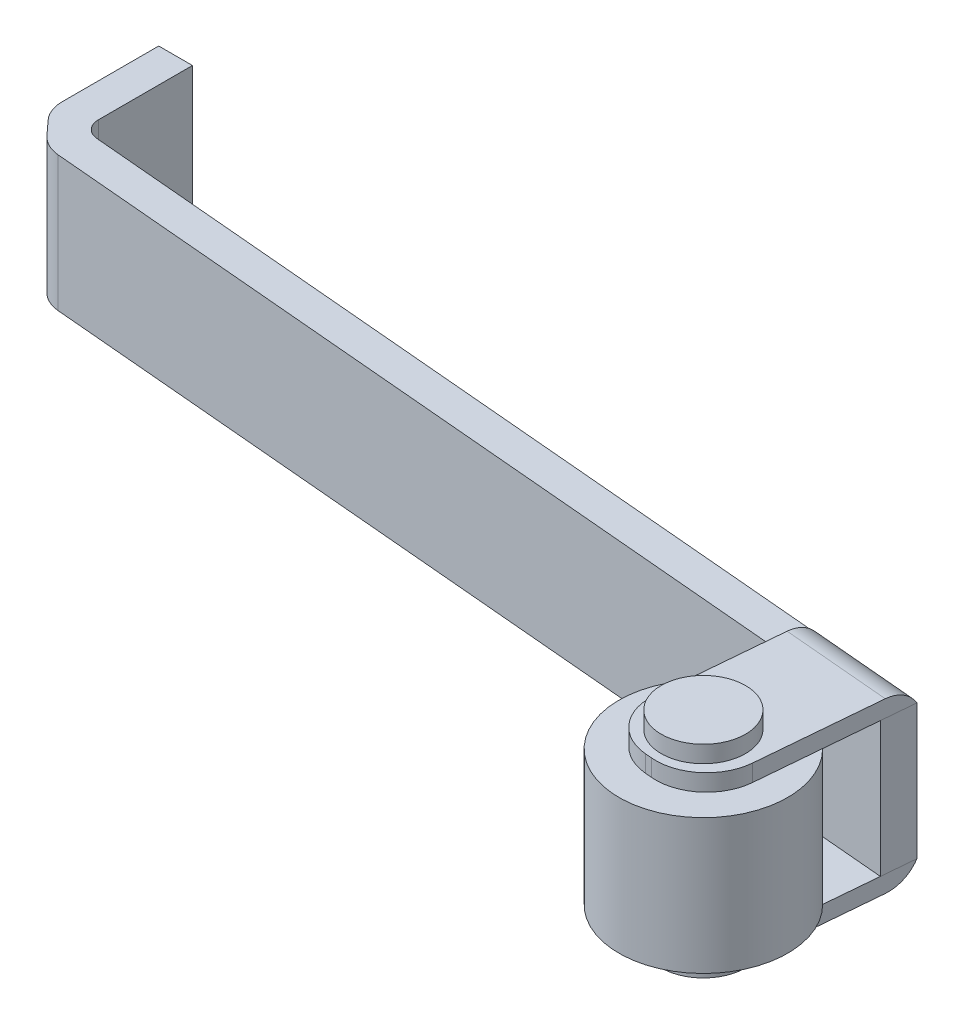
ISO-10303-21;
HEADER;
FILE_DESCRIPTION(('STEP AP214'),'2;1');
FILE_NAME('part.step','',(''),(''),'','','');
FILE_SCHEMA(('AUTOMOTIVE_DESIGN { 1 0 10303 214 1 1 1 1 }'));
ENDSEC;
DATA;
#1=APPLICATION_CONTEXT('core data for automotive mechanical design processes');
#2=APPLICATION_PROTOCOL_DEFINITION('international standard','automotive_design',2000,#1);
#3=PRODUCT_CONTEXT('',#1,'mechanical');
#4=PRODUCT('Part','Part','',(#3));
#5=PRODUCT_RELATED_PRODUCT_CATEGORY('part','',(#4));
#6=PRODUCT_DEFINITION_FORMATION('','',#4);
#7=PRODUCT_DEFINITION_CONTEXT('part definition',#1,'design');
#8=PRODUCT_DEFINITION('design','',#6,#7);
#9=PRODUCT_DEFINITION_SHAPE('','',#8);
#10=(LENGTH_UNIT() NAMED_UNIT(*) SI_UNIT(.MILLI.,.METRE.));
#11=(NAMED_UNIT(*) PLANE_ANGLE_UNIT() SI_UNIT($,.RADIAN.));
#12=(NAMED_UNIT(*) SI_UNIT($,.STERADIAN.) SOLID_ANGLE_UNIT());
#13=UNCERTAINTY_MEASURE_WITH_UNIT(LENGTH_MEASURE(1.E-05),#10,'distance_accuracy_value','');
#14=(GEOMETRIC_REPRESENTATION_CONTEXT(3) GLOBAL_UNCERTAINTY_ASSIGNED_CONTEXT((#13)) GLOBAL_UNIT_ASSIGNED_CONTEXT((#10,
#11,#12)) REPRESENTATION_CONTEXT('',''));
#15=CARTESIAN_POINT('',(0.,0.,0.));
#16=DIRECTION('',(0.,0.,1.));
#17=DIRECTION('',(1.,0.,0.));
#18=AXIS2_PLACEMENT_3D('',#15,#16,#17);
#19=CARTESIAN_POINT('',(28.0961628673172,6.75000000000002,5.6244415046445));
#20=DIRECTION('',(0.,-1.,0.));
#21=DIRECTION('',(0.,0.,-1.));
#22=AXIS2_PLACEMENT_3D('',#19,#20,#21);
#23=PLANE('',#22);
#24=DIRECTION('',(-0.087155742747656,0.,0.996194698091746));
#25=VECTOR('',#24,1.);
#26=CARTESIAN_POINT('',(28.0961628673172,6.75000000000002,5.6244415046445));
#27=LINE('',#26,#25);
#28=CARTESIAN_POINT('',(28.0961628673172,6.75000000000002,5.6244415046445));
#29=VERTEX_POINT('',#28);
#30=CARTESIAN_POINT('',(27.8713827395985,6.75000000000002,8.19369012109135));
#31=VERTEX_POINT('',#30);
#32=EDGE_CURVE('E198',#29,#31,#27,.T.);
#33=ORIENTED_EDGE('',*,*,#32,.T.);
#34=CARTESIAN_POINT('',(26.110050508006,6.75000000000001,9.9678684576611));
#35=DIRECTION('',(0.,1.,0.));
#36=DIRECTION('',(-1.,0.,0.));
#37=AXIS2_PLACEMENT_3D('',#34,#35,#36);
#38=CIRCLE('',#37,2.5);
#39=CARTESIAN_POINT('',(24.6835597057049,6.75000000000002,7.91479174429885));
#40=VERTEX_POINT('',#39);
#41=EDGE_CURVE('E68',#31,#40,#38,.T.);
#42=ORIENTED_EDGE('',*,*,#41,.T.);
#43=DIRECTION('',(-0.087155742747656,0.,0.996194698091746));
#44=VECTOR('',#43,1.);
#45=CARTESIAN_POINT('',(24.9083398334236,6.75000000000002,5.345543127852));
#46=LINE('',#45,#44);
#47=CARTESIAN_POINT('',(24.9083398334236,6.75000000000002,5.345543127852));
#48=VERTEX_POINT('',#47);
#49=EDGE_CURVE('E201',#48,#40,#46,.T.);
#50=ORIENTED_EDGE('',*,*,#49,.F.);
#51=DIRECTION('',(0.996194698091746,0.,0.0871557427476555));
#52=VECTOR('',#51,1.);
#53=CARTESIAN_POINT('',(28.0961628673172,6.75000000000002,5.6244415046445));
#54=LINE('',#53,#52);
#55=EDGE_CURVE('E194',#48,#29,#54,.T.);
#56=ORIENTED_EDGE('',*,*,#55,.T.);
#57=EDGE_LOOP('',(#33,#42,#50,#56));
#58=FACE_BOUND('',#57,.T.);
#59=ADVANCED_FACE('F44',(#58),#23,.T.);
#60=CARTESIAN_POINT('',(28.0961628673172,7.25000000000002,5.6244415046445));
#61=DIRECTION('',(0.,1.,0.));
#62=DIRECTION('',(-1.,0.,0.));
#63=AXIS2_PLACEMENT_3D('',#60,#61,#62);
#64=PLANE('',#63);
#65=DIRECTION('',(-0.996194698091746,0.,-0.0871557427476555));
#66=VECTOR('',#65,1.);
#67=CARTESIAN_POINT('',(27.5732284108313,7.25000000000002,11.601609693195));
#68=LINE('',#67,#66);
#69=CARTESIAN_POINT('',(26.0789363636937,7.25000000000002,11.4708760790735));
#70=VERTEX_POINT('',#69);
#71=CARTESIAN_POINT('',(25.8796974240753,7.25000000000002,11.453444930524));
#72=VERTEX_POINT('',#71);
#73=EDGE_CURVE('E189',#70,#72,#68,.T.);
#74=ORIENTED_EDGE('',*,*,#73,.F.);
#75=CARTESIAN_POINT('',(26.2096699778152,7.25000000000002,9.97658403193587));
#76=DIRECTION('',(0.,1.,0.));
#77=DIRECTION('',(-1.,0.,0.));
#78=AXIS2_PLACEMENT_3D('',#75,#76,#77);
#79=CIRCLE('',#78,1.5);
#80=CARTESIAN_POINT('',(27.7039620249528,7.25000000000002,10.1073176460574));
#81=VERTEX_POINT('',#80);
#82=EDGE_CURVE('E222',#70,#81,#79,.T.);
#83=ORIENTED_EDGE('',*,*,#82,.T.);
#84=DIRECTION('',(-0.087155742747656,0.,0.996194698091746));
#85=VECTOR('',#84,1.);
#86=CARTESIAN_POINT('',(28.0961628673172,7.25000000000002,5.6244415046445));
#87=LINE('',#86,#85);
#88=CARTESIAN_POINT('',(28.020683780012,7.25000000000002,6.48717142030732));
#89=VERTEX_POINT('',#88);
#90=EDGE_CURVE('E197',#89,#81,#87,.T.);
#91=ORIENTED_EDGE('',*,*,#90,.F.);
#92=DIRECTION('',(-0.996194698091746,0.,-0.0871557427476555));
#93=VECTOR('',#92,1.);
#94=CARTESIAN_POINT('',(24.8328607461185,7.25000000000002,6.20827304351482));
#95=LINE('',#94,#93);
#96=CARTESIAN_POINT('',(24.8328607461185,7.25000000000002,6.20827304351482));
#97=VERTEX_POINT('',#96);
#98=EDGE_CURVE('E200',#89,#97,#95,.T.);
#99=ORIENTED_EDGE('',*,*,#98,.T.);
#100=DIRECTION('',(-0.087155742747656,0.,0.996194698091746));
#101=VECTOR('',#100,1.);
#102=CARTESIAN_POINT('',(24.9083398334236,7.25000000000002,5.345543127852));
#103=LINE('',#102,#101);
#104=CARTESIAN_POINT('',(24.5161389910592,7.25000000000002,9.82841926926485));
#105=VERTEX_POINT('',#104);
#106=EDGE_CURVE('E203',#97,#105,#103,.T.);
#107=ORIENTED_EDGE('',*,*,#106,.T.);
#108=CARTESIAN_POINT('',(26.0104310381968,7.25000000000002,9.95915288338634));
#109=DIRECTION('',(0.,1.,0.));
#110=DIRECTION('',(-1.,0.,0.));
#111=AXIS2_PLACEMENT_3D('',#108,#109,#110);
#112=CIRCLE('',#111,1.5);
#113=EDGE_CURVE('E220',#105,#72,#112,.T.);
#114=ORIENTED_EDGE('',*,*,#113,.T.);
#115=EDGE_LOOP('',(#74,#83,#91,#99,#107,#114));
#116=FACE_BOUND('',#115,.T.);
#117=CARTESIAN_POINT('',(26.110050508006,7.25000000000002,9.9678684576611));
#118=DIRECTION('',(0.,1.,0.));
#119=DIRECTION('',(-1.,0.,0.));
#120=AXIS2_PLACEMENT_3D('',#117,#118,#119);
#121=CIRCLE('',#120,1.25);
#122=CARTESIAN_POINT('',(24.860050508006,7.25000000000002,9.9678684576611));
#123=VERTEX_POINT('',#122);
#124=EDGE_CURVE('E188',#123,#123,#121,.F.);
#125=ORIENTED_EDGE('',*,*,#124,.T.);
#126=EDGE_LOOP('',(#125));
#127=FACE_BOUND('',#126,.T.);
#128=ADVANCED_FACE('F233',(#116,#127),#64,.T.);
#129=CARTESIAN_POINT('',(28.0961628673172,6.75000000000002,5.6244415046445));
#130=DIRECTION('',(0.996194698091746,0.,0.087155742747656));
#131=DIRECTION('',(0.087155742747656,0.,-0.996194698091746));
#132=AXIS2_PLACEMENT_3D('',#129,#130,#131);
#133=PLANE('',#132);
#134=ORIENTED_EDGE('',*,*,#90,.T.);
#135=DIRECTION('',(0.,1.,0.));
#136=VECTOR('',#135,1.);
#137=CARTESIAN_POINT('',(27.7039620249528,6.75000000000002,10.1073176460574));
#138=LINE('',#137,#136);
#139=CARTESIAN_POINT('',(27.7039620249528,6.75000000000002,10.1073176460574));
#140=VERTEX_POINT('',#139);
#141=EDGE_CURVE('E224',#81,#140,#138,.F.);
#142=ORIENTED_EDGE('',*,*,#141,.T.);
#143=DIRECTION('',(-0.087155742747656,0.,0.996194698091746));
#144=VECTOR('',#143,1.);
#145=CARTESIAN_POINT('',(28.0961628673172,6.75000000000001,5.6244415046445));
#146=LINE('',#145,#144);
#147=EDGE_CURVE('E61',#31,#140,#146,.T.);
#148=ORIENTED_EDGE('',*,*,#147,.F.);
#149=ORIENTED_EDGE('',*,*,#32,.F.);
#150=CARTESIAN_POINT('',(28.020683780012,6.25000000000001,6.48717142030732));
#151=DIRECTION('',(0.996194698091746,0.,0.087155742747656));
#152=DIRECTION('',(0.087155742747656,0.,-0.996194698091746));
#153=AXIS2_PLACEMENT_3D('',#150,#151,#152);
#154=CIRCLE('',#153,1.);
#155=EDGE_CURVE('E212',#29,#89,#154,.T.);
#156=ORIENTED_EDGE('',*,*,#155,.T.);
#157=EDGE_LOOP('',(#134,#142,#148,#149,#156));
#158=FACE_BOUND('',#157,.T.);
#159=ADVANCED_FACE('F258',(#158),#133,.T.);
#160=CARTESIAN_POINT('',(24.9083398334236,6.75000000000002,5.345543127852));
#161=DIRECTION('',(-0.996194698091746,0.,-0.087155742747656));
#162=DIRECTION('',(-0.087155742747656,0.,0.996194698091746));
#163=AXIS2_PLACEMENT_3D('',#160,#161,#162);
#164=PLANE('',#163);
#165=ORIENTED_EDGE('',*,*,#49,.T.);
#166=DIRECTION('',(0.087155742747656,0.,-0.996194698091746));
#167=VECTOR('',#166,1.);
#168=CARTESIAN_POINT('',(24.9083398334236,6.75000000000001,5.345543127852));
#169=LINE('',#168,#167);
#170=CARTESIAN_POINT('',(24.5161389910592,6.75000000000001,9.82841926926485));
#171=VERTEX_POINT('',#170);
#172=EDGE_CURVE('E286',#171,#40,#169,.T.);
#173=ORIENTED_EDGE('',*,*,#172,.F.);
#174=DIRECTION('',(0.,-1.,0.));
#175=VECTOR('',#174,1.);
#176=CARTESIAN_POINT('',(24.5161389910592,6.75000000000002,9.82841926926485));
#177=LINE('',#176,#175);
#178=EDGE_CURVE('E12',#171,#105,#177,.F.);
#179=ORIENTED_EDGE('',*,*,#178,.T.);
#180=ORIENTED_EDGE('',*,*,#106,.F.);
#181=CARTESIAN_POINT('',(24.8328607461185,6.25000000000001,6.20827304351482));
#182=DIRECTION('',(-0.996194698091746,0.,-0.087155742747656));
#183=DIRECTION('',(-0.087155742747656,0.,0.996194698091746));
#184=AXIS2_PLACEMENT_3D('',#181,#182,#183);
#185=CIRCLE('',#184,1.);
#186=EDGE_CURVE('E210',#97,#48,#185,.T.);
#187=ORIENTED_EDGE('',*,*,#186,.T.);
#188=EDGE_LOOP('',(#165,#173,#179,#180,#187));
#189=FACE_BOUND('',#188,.T.);
#190=ADVANCED_FACE('F264',(#189),#164,.T.);
#191=CARTESIAN_POINT('',(-0.79784954247906,0.,9.11946200027012));
#192=DIRECTION('',(-0.0871557427476555,0.,0.996194698091746));
#193=DIRECTION('',(0.996194698091746,0.,0.0871557427476555));
#194=AXIS2_PLACEMENT_3D('',#191,#192,#193);
#195=PLANE('',#194);
#196=DIRECTION('',(0.996194698091746,0.,0.0871557427476555));
#197=VECTOR('',#196,1.);
#198=CARTESIAN_POINT('',(27.5732284108313,6.75000000000002,11.601609693195));
#199=LINE('',#198,#197);
#200=CARTESIAN_POINT('',(25.8796974240753,6.75000000000002,11.453444930524));
#201=VERTEX_POINT('',#200);
#202=CARTESIAN_POINT('',(26.0789363636937,6.75000000000002,11.4708760790735));
#203=VERTEX_POINT('',#202);
#204=EDGE_CURVE('E192',#201,#203,#199,.T.);
#205=ORIENTED_EDGE('',*,*,#204,.T.);
#206=DIRECTION('',(0.,1.,0.));
#207=VECTOR('',#206,1.);
#208=CARTESIAN_POINT('',(26.0789363636937,0.,11.4708760790735));
#209=LINE('',#208,#207);
#210=EDGE_CURVE('E217',#203,#70,#209,.T.);
#211=ORIENTED_EDGE('',*,*,#210,.T.);
#212=ORIENTED_EDGE('',*,*,#73,.T.);
#213=DIRECTION('',(0.,-1.,0.));
#214=VECTOR('',#213,1.);
#215=CARTESIAN_POINT('',(25.8796974240753,0.,11.453444930524));
#216=LINE('',#215,#214);
#217=EDGE_CURVE('E214',#72,#201,#216,.T.);
#218=ORIENTED_EDGE('',*,*,#217,.T.);
#219=EDGE_LOOP('',(#205,#211,#212,#218));
#220=FACE_BOUND('',#219,.T.);
#221=ADVANCED_FACE('F263',(#220),#195,.T.);
#222=CARTESIAN_POINT('',(-0.350394173298295,6.25000000000001,4.00502372738246));
#223=DIRECTION('',(0.996194698091746,0.,0.0871557427476555));
#224=DIRECTION('',(0.0871557427476555,0.,-0.996194698091746));
#225=AXIS2_PLACEMENT_3D('',#222,#223,#224);
#226=CYLINDRICAL_SURFACE('',#225,1.);
#227=ORIENTED_EDGE('',*,*,#155,.F.);
#228=ORIENTED_EDGE('',*,*,#55,.F.);
#229=ORIENTED_EDGE('',*,*,#186,.F.);
#230=ORIENTED_EDGE('',*,*,#98,.F.);
#231=EDGE_LOOP('',(#227,#228,#229,#230));
#232=FACE_BOUND('',#231,.T.);
#233=ADVANCED_FACE('F270',(#232),#226,.T.);
#234=CARTESIAN_POINT('',(26.2096699778152,0.,9.97658403193587));
#235=DIRECTION('',(0.,1.,0.));
#236=DIRECTION('',(0.,0.,1.));
#237=AXIS2_PLACEMENT_3D('',#234,#235,#236);
#238=CYLINDRICAL_SURFACE('',#237,1.5);
#239=CARTESIAN_POINT('',(26.2096699778152,6.75000000000002,9.97658403193587));
#240=DIRECTION('',(0.,-1.,0.));
#241=DIRECTION('',(0.,0.,-1.));
#242=AXIS2_PLACEMENT_3D('',#239,#240,#241);
#243=CIRCLE('',#242,1.5);
#244=EDGE_CURVE('E53',#140,#203,#243,.T.);
#245=ORIENTED_EDGE('',*,*,#244,.F.);
#246=ORIENTED_EDGE('',*,*,#141,.F.);
#247=ORIENTED_EDGE('',*,*,#82,.F.);
#248=ORIENTED_EDGE('',*,*,#210,.F.);
#249=EDGE_LOOP('',(#245,#246,#247,#248));
#250=FACE_BOUND('',#249,.T.);
#251=ADVANCED_FACE('F249',(#250),#238,.T.);
#252=CARTESIAN_POINT('',(26.0104310381968,0.,9.95915288338634));
#253=DIRECTION('',(0.,-1.,0.));
#254=DIRECTION('',(0.,0.,-1.));
#255=AXIS2_PLACEMENT_3D('',#252,#253,#254);
#256=CYLINDRICAL_SURFACE('',#255,1.5);
#257=ORIENTED_EDGE('',*,*,#113,.F.);
#258=ORIENTED_EDGE('',*,*,#178,.F.);
#259=CARTESIAN_POINT('',(26.0104310381968,6.75000000000002,9.95915288338634));
#260=DIRECTION('',(0.,-1.,0.));
#261=DIRECTION('',(0.,0.,-1.));
#262=AXIS2_PLACEMENT_3D('',#259,#260,#261);
#263=CIRCLE('',#262,1.5);
#264=EDGE_CURVE('E226',#201,#171,#263,.T.);
#265=ORIENTED_EDGE('',*,*,#264,.F.);
#266=ORIENTED_EDGE('',*,*,#217,.F.);
#267=EDGE_LOOP('',(#257,#258,#265,#266));
#268=FACE_BOUND('',#267,.T.);
#269=ADVANCED_FACE('F46',(#268),#256,.T.);
#270=CARTESIAN_POINT('',(0.,7.75000000000001,0.));
#271=DIRECTION('',(0.,-1.,0.));
#272=DIRECTION('',(1.,0.,0.));
#273=AXIS2_PLACEMENT_3D('',#270,#271,#272);
#274=PLANE('',#273);
#275=CARTESIAN_POINT('',(26.110050508006,7.75000000000001,9.9678684576611));
#276=DIRECTION('',(0.,-1.,0.));
#277=DIRECTION('',(1.,0.,0.));
#278=AXIS2_PLACEMENT_3D('',#275,#276,#277);
#279=CIRCLE('',#278,1.25);
#280=CARTESIAN_POINT('',(27.360050508006,7.75000000000001,9.9678684576611));
#281=VERTEX_POINT('',#280);
#282=EDGE_CURVE('E182',#281,#281,#279,.T.);
#283=ORIENTED_EDGE('',*,*,#282,.F.);
#284=EDGE_LOOP('',(#283));
#285=FACE_BOUND('',#284,.T.);
#286=ADVANCED_FACE('F239',(#285),#274,.F.);
#287=CARTESIAN_POINT('',(26.110050508006,1.75000000000001,9.9678684576611));
#288=DIRECTION('',(0.,1.,0.));
#289=DIRECTION('',(-1.,0.,0.));
#290=AXIS2_PLACEMENT_3D('',#287,#288,#289);
#291=CYLINDRICAL_SURFACE('',#290,1.25);
#292=ORIENTED_EDGE('',*,*,#124,.F.);
#293=EDGE_LOOP('',(#292));
#294=FACE_BOUND('',#293,.T.);
#295=ORIENTED_EDGE('',*,*,#282,.T.);
#296=EDGE_LOOP('',(#295));
#297=FACE_BOUND('',#296,.T.);
#298=ADVANCED_FACE('F235',(#294,#297),#291,.T.);
#299=CARTESIAN_POINT('',(26.110050508006,6.75000000000001,9.9678684576611));
#300=DIRECTION('',(0.,1.,0.));
#301=DIRECTION('',(-1.,0.,0.));
#302=AXIS2_PLACEMENT_3D('',#299,#300,#301);
#303=PLANE('',#302);
#304=EDGE_CURVE('E285',#40,#31,#38,.T.);
#305=ORIENTED_EDGE('',*,*,#304,.T.);
#306=ORIENTED_EDGE('',*,*,#147,.T.);
#307=ORIENTED_EDGE('',*,*,#244,.T.);
#308=ORIENTED_EDGE('',*,*,#204,.F.);
#309=ORIENTED_EDGE('',*,*,#264,.T.);
#310=ORIENTED_EDGE('',*,*,#172,.T.);
#311=EDGE_LOOP('',(#305,#306,#307,#308,#309,#310));
#312=FACE_BOUND('',#311,.T.);
#313=ADVANCED_FACE('F238',(#312),#303,.T.);
#314=CARTESIAN_POINT('',(26.110050508006,6.75000000000001,9.9678684576611));
#315=DIRECTION('',(0.,-1.,0.));
#316=DIRECTION('',(1.,0.,0.));
#317=AXIS2_PLACEMENT_3D('',#314,#315,#316);
#318=CYLINDRICAL_SURFACE('',#317,2.5);
#319=ORIENTED_EDGE('',*,*,#41,.F.);
#320=ORIENTED_EDGE('',*,*,#304,.F.);
#321=EDGE_LOOP('',(#319,#320));
#322=FACE_BOUND('',#321,.T.);
#323=CARTESIAN_POINT('',(26.110050508006,2.75000000000001,9.9678684576611));
#324=DIRECTION('',(0.,1.,0.));
#325=DIRECTION('',(-1.,0.,0.));
#326=AXIS2_PLACEMENT_3D('',#323,#324,#325);
#327=CIRCLE('',#326,2.5);
#328=CARTESIAN_POINT('',(27.8713827395985,2.75000000000001,8.19369012109135));
#329=VERTEX_POINT('',#328);
#330=CARTESIAN_POINT('',(24.6835597057049,2.75000000000001,7.91479174429885));
#331=VERTEX_POINT('',#330);
#332=EDGE_CURVE('E336',#329,#331,#327,.T.);
#333=ORIENTED_EDGE('',*,*,#332,.T.);
#334=EDGE_CURVE('E333',#331,#329,#327,.T.);
#335=ORIENTED_EDGE('',*,*,#334,.T.);
#336=EDGE_LOOP('',(#333,#335));
#337=FACE_BOUND('',#336,.T.);
#338=ADVANCED_FACE('F339',(#322,#337),#318,.T.);
#339=CARTESIAN_POINT('',(26.110050508006,2.75000000000001,9.9678684576611));
#340=DIRECTION('',(0.,1.,0.));
#341=DIRECTION('',(-1.,0.,0.));
#342=AXIS2_PLACEMENT_3D('',#339,#340,#341);
#343=PLANE('',#342);
#344=DIRECTION('',(0.087155742747656,0.,-0.996194698091746));
#345=VECTOR('',#344,1.);
#346=CARTESIAN_POINT('',(24.9083398334236,2.75000000000001,5.345543127852));
#347=LINE('',#346,#345);
#348=CARTESIAN_POINT('',(24.5161389910592,2.75000000000001,9.82841926926485));
#349=VERTEX_POINT('',#348);
#350=EDGE_CURVE('E168',#349,#331,#347,.T.);
#351=ORIENTED_EDGE('',*,*,#350,.F.);
#352=CARTESIAN_POINT('',(26.0104310381968,2.75000000000001,9.95915288338634));
#353=DIRECTION('',(0.,1.,0.));
#354=DIRECTION('',(-1.,0.,0.));
#355=AXIS2_PLACEMENT_3D('',#352,#353,#354);
#356=CIRCLE('',#355,1.5);
#357=CARTESIAN_POINT('',(25.8796974240753,2.75000000000001,11.453444930524));
#358=VERTEX_POINT('',#357);
#359=EDGE_CURVE('E157',#349,#358,#356,.T.);
#360=ORIENTED_EDGE('',*,*,#359,.T.);
#361=DIRECTION('',(-0.996194698091746,0.,-0.0871557427476555));
#362=VECTOR('',#361,1.);
#363=CARTESIAN_POINT('',(27.5732284108313,2.75000000000001,11.601609693195));
#364=LINE('',#363,#362);
#365=CARTESIAN_POINT('',(26.0789363636937,2.75000000000001,11.4708760790735));
#366=VERTEX_POINT('',#365);
#367=EDGE_CURVE('E174',#366,#358,#364,.T.);
#368=ORIENTED_EDGE('',*,*,#367,.F.);
#369=CARTESIAN_POINT('',(26.2096699778152,2.75000000000001,9.97658403193587));
#370=DIRECTION('',(0.,1.,0.));
#371=DIRECTION('',(-1.,0.,0.));
#372=AXIS2_PLACEMENT_3D('',#369,#370,#371);
#373=CIRCLE('',#372,1.5);
#374=CARTESIAN_POINT('',(27.7039620249528,2.75000000000001,10.1073176460574));
#375=VERTEX_POINT('',#374);
#376=EDGE_CURVE('E151',#366,#375,#373,.T.);
#377=ORIENTED_EDGE('',*,*,#376,.T.);
#378=DIRECTION('',(-0.087155742747656,0.,0.996194698091746));
#379=VECTOR('',#378,1.);
#380=CARTESIAN_POINT('',(28.0961628673172,2.75000000000001,5.6244415046445));
#381=LINE('',#380,#379);
#382=EDGE_CURVE('E161',#329,#375,#381,.T.);
#383=ORIENTED_EDGE('',*,*,#382,.F.);
#384=ORIENTED_EDGE('',*,*,#334,.F.);
#385=EDGE_LOOP('',(#351,#360,#368,#377,#383,#384));
#386=FACE_BOUND('',#385,.T.);
#387=ADVANCED_FACE('F172',(#386),#343,.F.);
#388=CARTESIAN_POINT('',(0.,1.75000000000001,0.));
#389=DIRECTION('',(0.,-1.,0.));
#390=DIRECTION('',(1.,0.,0.));
#391=AXIS2_PLACEMENT_3D('',#388,#389,#390);
#392=PLANE('',#391);
#393=CARTESIAN_POINT('',(26.110050508006,1.75000000000001,9.9678684576611));
#394=DIRECTION('',(0.,-1.,0.));
#395=DIRECTION('',(1.,0.,0.));
#396=AXIS2_PLACEMENT_3D('',#393,#394,#395);
#397=CIRCLE('',#396,1.25);
#398=CARTESIAN_POINT('',(27.360050508006,1.75000000000001,9.9678684576611));
#399=VERTEX_POINT('',#398);
#400=EDGE_CURVE('E185',#399,#399,#397,.T.);
#401=ORIENTED_EDGE('',*,*,#400,.T.);
#402=EDGE_LOOP('',(#401));
#403=FACE_BOUND('',#402,.T.);
#404=ADVANCED_FACE('F347',(#403),#392,.T.);
#405=CARTESIAN_POINT('',(26.110050508006,2.25000000000001,9.9678684576611));
#406=DIRECTION('',(0.,-1.,0.));
#407=DIRECTION('',(1.,0.,0.));
#408=AXIS2_PLACEMENT_3D('',#405,#406,#407);
#409=CIRCLE('',#408,1.25);
#410=CARTESIAN_POINT('',(27.360050508006,2.25000000000001,9.9678684576611));
#411=VERTEX_POINT('',#410);
#412=EDGE_CURVE('E48',#411,#411,#409,.T.);
#413=ORIENTED_EDGE('',*,*,#412,.T.);
#414=EDGE_LOOP('',(#413));
#415=FACE_BOUND('',#414,.T.);
#416=ORIENTED_EDGE('',*,*,#400,.F.);
#417=EDGE_LOOP('',(#416));
#418=FACE_BOUND('',#417,.T.);
#419=ADVANCED_FACE('F241',(#415,#418),#291,.T.);
#420=CARTESIAN_POINT('',(-0.350394173298296,3.25000000000001,4.00502372738247));
#421=DIRECTION('',(0.996194698091746,0.,0.0871557427476555));
#422=DIRECTION('',(0.0871557427476555,0.,-0.996194698091746));
#423=AXIS2_PLACEMENT_3D('',#420,#421,#422);
#424=CYLINDRICAL_SURFACE('',#423,1.);
#425=CARTESIAN_POINT('',(24.8328607461185,3.25000000000001,6.20827304351482));
#426=DIRECTION('',(-0.996194698091746,0.,-0.087155742747656));
#427=DIRECTION('',(-0.087155742747656,0.,0.996194698091746));
#428=AXIS2_PLACEMENT_3D('',#425,#426,#427);
#429=CIRCLE('',#428,1.);
#430=CARTESIAN_POINT('',(24.9083398334236,2.75000000000001,5.345543127852));
#431=VERTEX_POINT('',#430);
#432=CARTESIAN_POINT('',(24.8328607461185,2.25000000000001,6.20827304351482));
#433=VERTEX_POINT('',#432);
#434=EDGE_CURVE('E312',#431,#433,#429,.T.);
#435=ORIENTED_EDGE('',*,*,#434,.F.);
#436=DIRECTION('',(-0.996194698091746,0.,-0.0871557427476555));
#437=VECTOR('',#436,1.);
#438=CARTESIAN_POINT('',(28.0961628673172,2.75000000000001,5.6244415046445));
#439=LINE('',#438,#437);
#440=CARTESIAN_POINT('',(28.0961628673172,2.75000000000001,5.6244415046445));
#441=VERTEX_POINT('',#440);
#442=EDGE_CURVE('E295',#441,#431,#439,.T.);
#443=ORIENTED_EDGE('',*,*,#442,.F.);
#444=CARTESIAN_POINT('',(28.020683780012,3.25000000000001,6.48717142030732));
#445=DIRECTION('',(0.996194698091746,0.,0.087155742747656));
#446=DIRECTION('',(0.087155742747656,0.,-0.996194698091746));
#447=AXIS2_PLACEMENT_3D('',#444,#445,#446);
#448=CIRCLE('',#447,1.);
#449=CARTESIAN_POINT('',(28.020683780012,2.25000000000001,6.48717142030732));
#450=VERTEX_POINT('',#449);
#451=EDGE_CURVE('E310',#450,#441,#448,.T.);
#452=ORIENTED_EDGE('',*,*,#451,.F.);
#453=DIRECTION('',(-0.996194698091746,0.,-0.0871557427476555));
#454=VECTOR('',#453,1.);
#455=CARTESIAN_POINT('',(28.020683780012,2.25000000000001,6.48717142030732));
#456=LINE('',#455,#454);
#457=EDGE_CURVE('E300',#433,#450,#456,.F.);
#458=ORIENTED_EDGE('',*,*,#457,.F.);
#459=EDGE_LOOP('',(#435,#443,#452,#458));
#460=FACE_BOUND('',#459,.T.);
#461=ADVANCED_FACE('F357',(#460),#424,.T.);
#462=CARTESIAN_POINT('',(28.0961628673172,2.25000000000001,5.6244415046445));
#463=DIRECTION('',(0.,-1.,0.));
#464=DIRECTION('',(1.,0.,0.));
#465=AXIS2_PLACEMENT_3D('',#462,#463,#464);
#466=PLANE('',#465);
#467=DIRECTION('',(0.996194698091746,0.,0.0871557427476555));
#468=VECTOR('',#467,1.);
#469=CARTESIAN_POINT('',(27.5732284108313,2.25000000000001,11.601609693195));
#470=LINE('',#469,#468);
#471=CARTESIAN_POINT('',(25.8796974240753,2.25000000000001,11.453444930524));
#472=VERTEX_POINT('',#471);
#473=CARTESIAN_POINT('',(26.0789363636937,2.25000000000001,11.4708760790735));
#474=VERTEX_POINT('',#473);
#475=EDGE_CURVE('E288',#472,#474,#470,.T.);
#476=ORIENTED_EDGE('',*,*,#475,.F.);
#477=CARTESIAN_POINT('',(26.0104310381968,2.25000000000001,9.95915288338634));
#478=DIRECTION('',(0.,-1.,0.));
#479=DIRECTION('',(1.,0.,0.));
#480=AXIS2_PLACEMENT_3D('',#477,#478,#479);
#481=CIRCLE('',#480,1.5);
#482=CARTESIAN_POINT('',(24.5161389910592,2.25000000000001,9.82841926926485));
#483=VERTEX_POINT('',#482);
#484=EDGE_CURVE('E178',#472,#483,#481,.T.);
#485=ORIENTED_EDGE('',*,*,#484,.T.);
#486=DIRECTION('',(-0.087155742747656,0.,0.996194698091746));
#487=VECTOR('',#486,1.);
#488=CARTESIAN_POINT('',(24.9083398334236,2.25000000000001,5.345543127852));
#489=LINE('',#488,#487);
#490=EDGE_CURVE('E301',#433,#483,#489,.T.);
#491=ORIENTED_EDGE('',*,*,#490,.F.);
#492=ORIENTED_EDGE('',*,*,#457,.T.);
#493=DIRECTION('',(-0.087155742747656,0.,0.996194698091746));
#494=VECTOR('',#493,1.);
#495=CARTESIAN_POINT('',(28.0961628673172,2.25000000000001,5.6244415046445));
#496=LINE('',#495,#494);
#497=CARTESIAN_POINT('',(27.7039620249528,2.25000000000001,10.1073176460574));
#498=VERTEX_POINT('',#497);
#499=EDGE_CURVE('E298',#450,#498,#496,.T.);
#500=ORIENTED_EDGE('',*,*,#499,.T.);
#501=CARTESIAN_POINT('',(26.2096699778152,2.25000000000001,9.97658403193587));
#502=DIRECTION('',(0.,-1.,0.));
#503=DIRECTION('',(1.,0.,0.));
#504=AXIS2_PLACEMENT_3D('',#501,#502,#503);
#505=CIRCLE('',#504,1.5);
#506=EDGE_CURVE('E153',#498,#474,#505,.T.);
#507=ORIENTED_EDGE('',*,*,#506,.T.);
#508=EDGE_LOOP('',(#476,#485,#491,#492,#500,#507));
#509=FACE_BOUND('',#508,.T.);
#510=ORIENTED_EDGE('',*,*,#412,.F.);
#511=EDGE_LOOP('',(#510));
#512=FACE_BOUND('',#511,.T.);
#513=ADVANCED_FACE('F322',(#509,#512),#466,.T.);
#514=CARTESIAN_POINT('',(26.2096699778152,0.,9.97658403193587));
#515=DIRECTION('',(0.,-1.,0.));
#516=DIRECTION('',(0.,0.,-1.));
#517=AXIS2_PLACEMENT_3D('',#514,#515,#516);
#518=CYLINDRICAL_SURFACE('',#517,1.5);
#519=ORIENTED_EDGE('',*,*,#506,.F.);
#520=DIRECTION('',(0.,1.,0.));
#521=VECTOR('',#520,1.);
#522=CARTESIAN_POINT('',(27.7039620249528,2.25000000000001,10.1073176460574));
#523=LINE('',#522,#521);
#524=EDGE_CURVE('E146',#375,#498,#523,.F.);
#525=ORIENTED_EDGE('',*,*,#524,.F.);
#526=ORIENTED_EDGE('',*,*,#376,.F.);
#527=DIRECTION('',(0.,1.,0.));
#528=VECTOR('',#527,1.);
#529=CARTESIAN_POINT('',(26.0789363636937,2.75000000000001,11.4708760790735));
#530=LINE('',#529,#528);
#531=EDGE_CURVE('E314',#474,#366,#530,.T.);
#532=ORIENTED_EDGE('',*,*,#531,.F.);
#533=EDGE_LOOP('',(#519,#525,#526,#532));
#534=FACE_BOUND('',#533,.T.);
#535=ADVANCED_FACE('F148',(#534),#518,.T.);
#536=CARTESIAN_POINT('',(26.0104310381968,0.,9.95915288338634));
#537=DIRECTION('',(0.,1.,0.));
#538=DIRECTION('',(0.,0.,1.));
#539=AXIS2_PLACEMENT_3D('',#536,#537,#538);
#540=CYLINDRICAL_SURFACE('',#539,1.5);
#541=ORIENTED_EDGE('',*,*,#359,.F.);
#542=DIRECTION('',(0.,-1.,0.));
#543=VECTOR('',#542,1.);
#544=CARTESIAN_POINT('',(24.5161389910592,2.75000000000001,9.82841926926485));
#545=LINE('',#544,#543);
#546=EDGE_CURVE('E175',#483,#349,#545,.F.);
#547=ORIENTED_EDGE('',*,*,#546,.F.);
#548=ORIENTED_EDGE('',*,*,#484,.F.);
#549=DIRECTION('',(0.,-1.,0.));
#550=VECTOR('',#549,1.);
#551=CARTESIAN_POINT('',(25.8796974240753,2.25000000000001,11.453444930524));
#552=LINE('',#551,#550);
#553=EDGE_CURVE('E316',#358,#472,#552,.T.);
#554=ORIENTED_EDGE('',*,*,#553,.F.);
#555=EDGE_LOOP('',(#541,#547,#548,#554));
#556=FACE_BOUND('',#555,.T.);
#557=ADVANCED_FACE('F332',(#556),#540,.T.);
#558=CARTESIAN_POINT('',(-0.79784954247906,0.,9.11946200027012));
#559=DIRECTION('',(0.0871557427476555,0.,-0.996194698091746));
#560=DIRECTION('',(-0.996194698091746,0.,-0.0871557427476555));
#561=AXIS2_PLACEMENT_3D('',#558,#559,#560);
#562=PLANE('',#561);
#563=ORIENTED_EDGE('',*,*,#367,.T.);
#564=ORIENTED_EDGE('',*,*,#553,.T.);
#565=ORIENTED_EDGE('',*,*,#475,.T.);
#566=ORIENTED_EDGE('',*,*,#531,.T.);
#567=EDGE_LOOP('',(#563,#564,#565,#566));
#568=FACE_BOUND('',#567,.T.);
#569=ADVANCED_FACE('F351',(#568),#562,.F.);
#570=CARTESIAN_POINT('',(24.9083398334236,2.75000000000001,5.345543127852));
#571=DIRECTION('',(-0.996194698091746,0.,-0.087155742747656));
#572=DIRECTION('',(-0.087155742747656,0.,0.996194698091746));
#573=AXIS2_PLACEMENT_3D('',#570,#571,#572);
#574=PLANE('',#573);
#575=ORIENTED_EDGE('',*,*,#490,.T.);
#576=ORIENTED_EDGE('',*,*,#546,.T.);
#577=ORIENTED_EDGE('',*,*,#350,.T.);
#578=DIRECTION('',(-0.087155742747656,0.,0.996194698091746));
#579=VECTOR('',#578,1.);
#580=CARTESIAN_POINT('',(24.9083398334236,2.75000000000001,5.345543127852));
#581=LINE('',#580,#579);
#582=EDGE_CURVE('E304',#431,#331,#581,.T.);
#583=ORIENTED_EDGE('',*,*,#582,.F.);
#584=ORIENTED_EDGE('',*,*,#434,.T.);
#585=EDGE_LOOP('',(#575,#576,#577,#583,#584));
#586=FACE_BOUND('',#585,.T.);
#587=ADVANCED_FACE('F329',(#586),#574,.T.);
#588=CARTESIAN_POINT('',(28.0961628673172,2.75000000000001,5.6244415046445));
#589=DIRECTION('',(0.996194698091746,0.,0.087155742747656));
#590=DIRECTION('',(0.087155742747656,0.,-0.996194698091746));
#591=AXIS2_PLACEMENT_3D('',#588,#589,#590);
#592=PLANE('',#591);
#593=DIRECTION('',(-0.087155742747656,0.,0.996194698091746));
#594=VECTOR('',#593,1.);
#595=CARTESIAN_POINT('',(28.0961628673172,2.75000000000001,5.6244415046445));
#596=LINE('',#595,#594);
#597=EDGE_CURVE('E164',#441,#329,#596,.T.);
#598=ORIENTED_EDGE('',*,*,#597,.T.);
#599=ORIENTED_EDGE('',*,*,#382,.T.);
#600=ORIENTED_EDGE('',*,*,#524,.T.);
#601=ORIENTED_EDGE('',*,*,#499,.F.);
#602=ORIENTED_EDGE('',*,*,#451,.T.);
#603=EDGE_LOOP('',(#598,#599,#600,#601,#602));
#604=FACE_BOUND('',#603,.T.);
#605=ADVANCED_FACE('F162',(#604),#592,.T.);
#606=CARTESIAN_POINT('',(28.0961628673172,2.75000000000001,5.6244415046445));
#607=DIRECTION('',(0.,1.,0.));
#608=DIRECTION('',(-1.,0.,0.));
#609=AXIS2_PLACEMENT_3D('',#606,#607,#608);
#610=PLANE('',#609);
#611=ORIENTED_EDGE('',*,*,#582,.T.);
#612=ORIENTED_EDGE('',*,*,#332,.F.);
#613=ORIENTED_EDGE('',*,*,#597,.F.);
#614=ORIENTED_EDGE('',*,*,#442,.T.);
#615=EDGE_LOOP('',(#611,#612,#613,#614));
#616=FACE_BOUND('',#615,.T.);
#617=ADVANCED_FACE('F360',(#616),#610,.T.);
#618=CLOSED_SHELL('',(#59,#128,#159,#190,#221,#233,#251,#269,#286,#298,#313,#338,#387,#404,#419,
#461,#513,#535,#557,#569,#587,#605,#617));
#619=MANIFOLD_SOLID_BREP('B2',#618);
#620=CARTESIAN_POINT('',(1.,0.,4.25));
#621=DIRECTION('',(-1.,0.,0.));
#622=DIRECTION('',(0.,-1.,0.));
#623=AXIS2_PLACEMENT_3D('',#620,#621,#622);
#624=PLANE('',#623);
#625=DIRECTION('',(0.,0.,-1.));
#626=VECTOR('',#625,1.);
#627=CARTESIAN_POINT('',(1.,6.75000000000002,4.25));
#628=LINE('',#627,#626);
#629=CARTESIAN_POINT('',(1.,6.75000000000002,2.79183441299125));
#630=VERTEX_POINT('',#629);
#631=CARTESIAN_POINT('',(1.,6.75000000000002,0.));
#632=VERTEX_POINT('',#631);
#633=EDGE_CURVE('E649',#630,#632,#628,.T.);
#634=ORIENTED_EDGE('',*,*,#633,.F.);
#635=DIRECTION('',(0.,-1.,0.));
#636=VECTOR('',#635,1.);
#637=CARTESIAN_POINT('',(1.,2.75000000000001,2.79183441299125));
#638=LINE('',#637,#636);
#639=CARTESIAN_POINT('',(1.,2.75000000000001,2.79183441299125));
#640=VERTEX_POINT('',#639);
#641=EDGE_CURVE('E656',#630,#640,#638,.T.);
#642=ORIENTED_EDGE('',*,*,#641,.T.);
#643=DIRECTION('',(0.,0.,-1.));
#644=VECTOR('',#643,1.);
#645=CARTESIAN_POINT('',(1.,2.75000000000001,4.25));
#646=LINE('',#645,#644);
#647=CARTESIAN_POINT('',(1.,2.75000000000001,0.));
#648=VERTEX_POINT('',#647);
#649=EDGE_CURVE('E643',#640,#648,#646,.T.);
#650=ORIENTED_EDGE('',*,*,#649,.T.);
#651=DIRECTION('',(0.,1.,0.));
#652=VECTOR('',#651,1.);
#653=CARTESIAN_POINT('',(1.,0.,0.));
#654=LINE('',#653,#652);
#655=EDGE_CURVE('E626',#648,#632,#654,.T.);
#656=ORIENTED_EDGE('',*,*,#655,.T.);
#657=EDGE_LOOP('',(#634,#642,#650,#656));
#658=FACE_BOUND('',#657,.T.);
#659=ADVANCED_FACE('F523',(#658),#624,.F.);
#660=CARTESIAN_POINT('',(0.,6.75000000000001,4.25));
#661=DIRECTION('',(0.,-1.,0.));
#662=DIRECTION('',(1.,0.,0.));
#663=AXIS2_PLACEMENT_3D('',#660,#661,#662);
#664=PLANE('',#663);
#665=DIRECTION('',(0.675590207615657,0.,0.737277336810127));
#666=VECTOR('',#665,1.);
#667=CARTESIAN_POINT('',(0.,6.75000000000001,3.25383442870219));
#668=LINE('',#667,#666);
#669=CARTESIAN_POINT('',(0.262722663189873,6.75000000000001,3.54054590446486));
#670=VERTEX_POINT('',#669);
#671=CARTESIAN_POINT('',(0.650121594062475,6.75000000000001,3.96331765103128));
#672=VERTEX_POINT('',#671);
#673=EDGE_CURVE('E651',#670,#672,#668,.T.);
#674=ORIENTED_EDGE('',*,*,#673,.T.);
#675=CARTESIAN_POINT('',(1.3873989308726,6.75000000000002,3.28772744341562));
#676=DIRECTION('',(0.,-1.,0.));
#677=DIRECTION('',(1.,0.,0.));
#678=AXIS2_PLACEMENT_3D('',#675,#676,#677);
#679=CIRCLE('',#678,1.);
#680=CARTESIAN_POINT('',(1.30024318812494,6.75000000000001,4.28392214150736));
#681=VERTEX_POINT('',#680);
#682=EDGE_CURVE('E531',#672,#681,#679,.F.);
#683=ORIENTED_EDGE('',*,*,#682,.T.);
#684=DIRECTION('',(-0.996194698091746,0.,-0.0871557427476559));
#685=VECTOR('',#684,1.);
#686=CARTESIAN_POINT('',(28.0090071245696,6.75000000000002,6.62063620273624));
#687=LINE('',#686,#685);
#688=CARTESIAN_POINT('',(28.0090071245696,6.75000000000002,6.62063620273624));
#689=VERTEX_POINT('',#688);
#690=EDGE_CURVE('E609',#689,#681,#687,.T.);
#691=ORIENTED_EDGE('',*,*,#690,.F.);
#692=DIRECTION('',(-0.087155742747656,0.,0.996194698091746));
#693=VECTOR('',#692,1.);
#694=CARTESIAN_POINT('',(28.0964957880955,6.75000000000002,5.6206362027362));
#695=LINE('',#694,#693);
#696=CARTESIAN_POINT('',(28.0964957880955,6.75000000000002,5.6206362027362));
#697=VERTEX_POINT('',#696);
#698=EDGE_CURVE('E602',#697,#689,#695,.T.);
#699=ORIENTED_EDGE('',*,*,#698,.F.);
#700=DIRECTION('',(-0.996194698091746,0.,-0.0871557427476559));
#701=VECTOR('',#700,1.);
#702=CARTESIAN_POINT('',(28.0964957880955,6.75000000000002,5.6206362027362));
#703=LINE('',#702,#701);
#704=CARTESIAN_POINT('',(1.45642212862616,6.75000000000002,3.28993176203712));
#705=VERTEX_POINT('',#704);
#706=EDGE_CURVE('E606',#697,#705,#703,.T.);
#707=ORIENTED_EDGE('',*,*,#706,.T.);
#708=CARTESIAN_POINT('',(1.5,6.75000000000001,2.79183441299125));
#709=DIRECTION('',(0.,-1.,0.));
#710=DIRECTION('',(1.,0.,0.));
#711=AXIS2_PLACEMENT_3D('',#708,#709,#710);
#712=CIRCLE('',#711,0.5);
#713=EDGE_CURVE('E662',#705,#630,#712,.T.);
#714=ORIENTED_EDGE('',*,*,#713,.T.);
#715=ORIENTED_EDGE('',*,*,#633,.T.);
#716=DIRECTION('',(-1.,0.,0.));
#717=VECTOR('',#716,1.);
#718=CARTESIAN_POINT('',(0.,6.75000000000001,0.));
#719=LINE('',#718,#717);
#720=CARTESIAN_POINT('',(0.,6.75000000000002,0.));
#721=VERTEX_POINT('',#720);
#722=EDGE_CURVE('E629',#632,#721,#719,.T.);
#723=ORIENTED_EDGE('',*,*,#722,.T.);
#724=DIRECTION('',(0.,0.,-1.));
#725=VECTOR('',#724,1.);
#726=CARTESIAN_POINT('',(0.,6.75000000000002,4.25));
#727=LINE('',#726,#725);
#728=CARTESIAN_POINT('',(0.,6.75000000000002,2.8649556968492));
#729=VERTEX_POINT('',#728);
#730=EDGE_CURVE('E647',#729,#721,#727,.T.);
#731=ORIENTED_EDGE('',*,*,#730,.F.);
#732=CARTESIAN_POINT('',(1.,6.75000000000001,2.8649556968492));
#733=DIRECTION('',(0.,-1.,0.));
#734=DIRECTION('',(1.,0.,0.));
#735=AXIS2_PLACEMENT_3D('',#732,#733,#734);
#736=CIRCLE('',#735,1.);
#737=EDGE_CURVE('E538',#729,#670,#736,.F.);
#738=ORIENTED_EDGE('',*,*,#737,.T.);
#739=EDGE_LOOP('',(#674,#683,#691,#699,#707,#714,#715,#723,#731,#738));
#740=FACE_BOUND('',#739,.T.);
#741=ADVANCED_FACE('F604',(#740),#664,.F.);
#742=CARTESIAN_POINT('',(0.,0.,4.25));
#743=DIRECTION('',(-1.,0.,0.));
#744=DIRECTION('',(0.,0.,1.));
#745=AXIS2_PLACEMENT_3D('',#742,#743,#744);
#746=PLANE('',#745);
#747=DIRECTION('',(0.,0.,-1.));
#748=VECTOR('',#747,1.);
#749=CARTESIAN_POINT('',(0.,2.75000000000001,4.25));
#750=LINE('',#749,#748);
#751=CARTESIAN_POINT('',(0.,2.75000000000001,2.8649556968492));
#752=VERTEX_POINT('',#751);
#753=CARTESIAN_POINT('',(0.,2.75000000000001,0.));
#754=VERTEX_POINT('',#753);
#755=EDGE_CURVE('E645',#752,#754,#750,.T.);
#756=ORIENTED_EDGE('',*,*,#755,.F.);
#757=DIRECTION('',(0.,1.,0.));
#758=VECTOR('',#757,1.);
#759=CARTESIAN_POINT('',(0.,0.,2.8649556968492));
#760=LINE('',#759,#758);
#761=EDGE_CURVE('E42',#752,#729,#760,.T.);
#762=ORIENTED_EDGE('',*,*,#761,.T.);
#763=ORIENTED_EDGE('',*,*,#730,.T.);
#764=DIRECTION('',(0.,1.,0.));
#765=VECTOR('',#764,1.);
#766=CARTESIAN_POINT('',(0.,0.,0.));
#767=LINE('',#766,#765);
#768=EDGE_CURVE('E637',#754,#721,#767,.T.);
#769=ORIENTED_EDGE('',*,*,#768,.F.);
#770=EDGE_LOOP('',(#756,#762,#763,#769));
#771=FACE_BOUND('',#770,.T.);
#772=ADVANCED_FACE('F690',(#771),#746,.T.);
#773=CARTESIAN_POINT('',(0.,2.75000000000001,4.25));
#774=DIRECTION('',(0.,-1.,0.));
#775=DIRECTION('',(1.,0.,0.));
#776=AXIS2_PLACEMENT_3D('',#773,#774,#775);
#777=PLANE('',#776);
#778=DIRECTION('',(-0.996194698091746,0.,-0.0871557427476559));
#779=VECTOR('',#778,1.);
#780=CARTESIAN_POINT('',(28.0090071245696,2.75000000000001,6.62063620273624));
#781=LINE('',#780,#779);
#782=CARTESIAN_POINT('',(28.0090071245696,2.75000000000001,6.62063620273624));
#783=VERTEX_POINT('',#782);
#784=CARTESIAN_POINT('',(1.30024318812494,2.75000000000001,4.28392214150736));
#785=VERTEX_POINT('',#784);
#786=EDGE_CURVE('E631',#783,#785,#781,.T.);
#787=ORIENTED_EDGE('',*,*,#786,.T.);
#788=CARTESIAN_POINT('',(1.3873989308726,2.75000000000001,3.28772744341562));
#789=DIRECTION('',(0.,-1.,0.));
#790=DIRECTION('',(1.,0.,0.));
#791=AXIS2_PLACEMENT_3D('',#788,#789,#790);
#792=CIRCLE('',#791,1.);
#793=CARTESIAN_POINT('',(0.650121594062475,2.75000000000001,3.96331765103128));
#794=VERTEX_POINT('',#793);
#795=EDGE_CURVE('E669',#785,#794,#792,.T.);
#796=ORIENTED_EDGE('',*,*,#795,.T.);
#797=DIRECTION('',(-0.675590207615657,0.,-0.737277336810127));
#798=VECTOR('',#797,1.);
#799=CARTESIAN_POINT('',(0.496187430274208,2.75000000000001,3.79532798948415));
#800=LINE('',#799,#798);
#801=CARTESIAN_POINT('',(0.262722663189873,2.75000000000001,3.54054590446486));
#802=VERTEX_POINT('',#801);
#803=EDGE_CURVE('E653',#794,#802,#800,.T.);
#804=ORIENTED_EDGE('',*,*,#803,.T.);
#805=CARTESIAN_POINT('',(1.,2.75000000000001,2.8649556968492));
#806=DIRECTION('',(0.,-1.,0.));
#807=DIRECTION('',(1.,0.,0.));
#808=AXIS2_PLACEMENT_3D('',#805,#806,#807);
#809=CIRCLE('',#808,1.);
#810=EDGE_CURVE('E667',#802,#752,#809,.T.);
#811=ORIENTED_EDGE('',*,*,#810,.T.);
#812=ORIENTED_EDGE('',*,*,#755,.T.);
#813=DIRECTION('',(-1.,0.,0.));
#814=VECTOR('',#813,1.);
#815=CARTESIAN_POINT('',(0.,2.75000000000001,0.));
#816=LINE('',#815,#814);
#817=EDGE_CURVE('E640',#648,#754,#816,.T.);
#818=ORIENTED_EDGE('',*,*,#817,.F.);
#819=ORIENTED_EDGE('',*,*,#649,.F.);
#820=CARTESIAN_POINT('',(1.5,2.75000000000001,2.79183441299125));
#821=DIRECTION('',(0.,-1.,0.));
#822=DIRECTION('',(1.,0.,0.));
#823=AXIS2_PLACEMENT_3D('',#820,#821,#822);
#824=CIRCLE('',#823,0.5);
#825=CARTESIAN_POINT('',(1.45642212862616,2.75000000000001,3.28993176203712));
#826=VERTEX_POINT('',#825);
#827=EDGE_CURVE('E660',#640,#826,#824,.F.);
#828=ORIENTED_EDGE('',*,*,#827,.T.);
#829=DIRECTION('',(-0.996194698091746,0.,-0.0871557427476559));
#830=VECTOR('',#829,1.);
#831=CARTESIAN_POINT('',(28.0964957880955,2.75000000000001,5.6206362027362));
#832=LINE('',#831,#830);
#833=CARTESIAN_POINT('',(28.0964957880955,2.75000000000001,5.6206362027362));
#834=VERTEX_POINT('',#833);
#835=EDGE_CURVE('E802',#834,#826,#832,.T.);
#836=ORIENTED_EDGE('',*,*,#835,.F.);
#837=DIRECTION('',(0.0871557427476559,0.,-0.996194698091746));
#838=VECTOR('',#837,1.);
#839=CARTESIAN_POINT('',(28.0964957880955,2.75000000000001,5.6206362027362));
#840=LINE('',#839,#838);
#841=EDGE_CURVE('E618',#783,#834,#840,.T.);
#842=ORIENTED_EDGE('',*,*,#841,.F.);
#843=EDGE_LOOP('',(#787,#796,#804,#811,#812,#818,#819,#828,#836,#842));
#844=FACE_BOUND('',#843,.T.);
#845=ADVANCED_FACE('F683',(#844),#777,.T.);
#846=CARTESIAN_POINT('',(0.,0.,0.));
#847=DIRECTION('',(0.,0.,1.));
#848=DIRECTION('',(1.,0.,0.));
#849=AXIS2_PLACEMENT_3D('',#846,#847,#848);
#850=PLANE('',#849);
#851=ORIENTED_EDGE('',*,*,#655,.F.);
#852=ORIENTED_EDGE('',*,*,#817,.T.);
#853=ORIENTED_EDGE('',*,*,#768,.T.);
#854=ORIENTED_EDGE('',*,*,#722,.F.);
#855=EDGE_LOOP('',(#851,#852,#853,#854));
#856=FACE_BOUND('',#855,.T.);
#857=ADVANCED_FACE('F695',(#856),#850,.F.);
#858=CARTESIAN_POINT('',(28.0964957880955,2.75000000000001,5.6206362027362));
#859=DIRECTION('',(-0.0871557427476559,0.,0.996194698091746));
#860=DIRECTION('',(0.996194698091746,0.,0.0871557427476559));
#861=AXIS2_PLACEMENT_3D('',#858,#859,#860);
#862=PLANE('',#861);
#863=ORIENTED_EDGE('',*,*,#835,.T.);
#864=DIRECTION('',(0.,-1.,0.));
#865=VECTOR('',#864,1.);
#866=CARTESIAN_POINT('',(1.45642212862617,6.75000000000002,3.28993176203712));
#867=LINE('',#866,#865);
#868=EDGE_CURVE('E625',#826,#705,#867,.F.);
#869=ORIENTED_EDGE('',*,*,#868,.T.);
#870=ORIENTED_EDGE('',*,*,#706,.F.);
#871=DIRECTION('',(0.,1.,0.));
#872=VECTOR('',#871,1.);
#873=CARTESIAN_POINT('',(28.0964957880955,2.75000000000001,5.6206362027362));
#874=LINE('',#873,#872);
#875=EDGE_CURVE('E613',#834,#697,#874,.T.);
#876=ORIENTED_EDGE('',*,*,#875,.F.);
#877=EDGE_LOOP('',(#863,#869,#870,#876));
#878=FACE_BOUND('',#877,.T.);
#879=ADVANCED_FACE('F623',(#878),#862,.F.);
#880=CARTESIAN_POINT('',(28.0090071245696,2.75000000000001,6.62063620273624));
#881=DIRECTION('',(0.0871557427476559,0.,-0.996194698091746));
#882=DIRECTION('',(-0.996194698091746,0.,-0.0871557427476559));
#883=AXIS2_PLACEMENT_3D('',#880,#881,#882);
#884=PLANE('',#883);
#885=ORIENTED_EDGE('',*,*,#690,.T.);
#886=DIRECTION('',(0.,-1.,0.));
#887=VECTOR('',#886,1.);
#888=CARTESIAN_POINT('',(1.30024318812495,2.75000000000001,4.28392214150736));
#889=LINE('',#888,#887);
#890=EDGE_CURVE('E664',#681,#785,#889,.T.);
#891=ORIENTED_EDGE('',*,*,#890,.T.);
#892=ORIENTED_EDGE('',*,*,#786,.F.);
#893=DIRECTION('',(0.,-1.,0.));
#894=VECTOR('',#893,1.);
#895=CARTESIAN_POINT('',(28.0090071245696,2.75000000000001,6.62063620273624));
#896=LINE('',#895,#894);
#897=EDGE_CURVE('E612',#689,#783,#896,.T.);
#898=ORIENTED_EDGE('',*,*,#897,.F.);
#899=EDGE_LOOP('',(#885,#891,#892,#898));
#900=FACE_BOUND('',#899,.T.);
#901=ADVANCED_FACE('F678',(#900),#884,.F.);
#902=CARTESIAN_POINT('',(28.3710779533103,0.,2.48214769292486));
#903=DIRECTION('',(0.996194698091746,0.,0.087155742747656));
#904=DIRECTION('',(0.087155742747656,0.,-0.996194698091746));
#905=AXIS2_PLACEMENT_3D('',#902,#903,#904);
#906=PLANE('',#905);
#907=ORIENTED_EDGE('',*,*,#875,.T.);
#908=ORIENTED_EDGE('',*,*,#698,.T.);
#909=ORIENTED_EDGE('',*,*,#897,.T.);
#910=ORIENTED_EDGE('',*,*,#841,.T.);
#911=EDGE_LOOP('',(#907,#908,#909,#910));
#912=FACE_BOUND('',#911,.T.);
#913=ADVANCED_FACE('F616',(#912),#906,.T.);
#914=CARTESIAN_POINT('',(0.,0.,3.25383442870219));
#915=DIRECTION('',(-0.737277336810127,0.,0.675590207615657));
#916=DIRECTION('',(0.,-1.,0.));
#917=AXIS2_PLACEMENT_3D('',#914,#915,#916);
#918=PLANE('',#917);
#919=ORIENTED_EDGE('',*,*,#803,.F.);
#920=DIRECTION('',(0.,-1.,0.));
#921=VECTOR('',#920,1.);
#922=CARTESIAN_POINT('',(0.650121594062475,6.75000000000002,3.96331765103128));
#923=LINE('',#922,#921);
#924=EDGE_CURVE('E545',#794,#672,#923,.F.);
#925=ORIENTED_EDGE('',*,*,#924,.T.);
#926=ORIENTED_EDGE('',*,*,#673,.F.);
#927=DIRECTION('',(0.,1.,0.));
#928=VECTOR('',#927,1.);
#929=CARTESIAN_POINT('',(0.262722663189873,0.,3.54054590446486));
#930=LINE('',#929,#928);
#931=EDGE_CURVE('E671',#670,#802,#930,.F.);
#932=ORIENTED_EDGE('',*,*,#931,.T.);
#933=EDGE_LOOP('',(#919,#925,#926,#932));
#934=FACE_BOUND('',#933,.T.);
#935=ADVANCED_FACE('F685',(#934),#918,.T.);
#936=CARTESIAN_POINT('',(1.5,0.,2.79183441299125));
#937=DIRECTION('',(0.,1.,0.));
#938=DIRECTION('',(-1.,0.,0.));
#939=AXIS2_PLACEMENT_3D('',#936,#937,#938);
#940=CYLINDRICAL_SURFACE('',#939,0.5);
#941=ORIENTED_EDGE('',*,*,#713,.F.);
#942=ORIENTED_EDGE('',*,*,#868,.F.);
#943=ORIENTED_EDGE('',*,*,#827,.F.);
#944=ORIENTED_EDGE('',*,*,#641,.F.);
#945=EDGE_LOOP('',(#941,#942,#943,#944));
#946=FACE_BOUND('',#945,.T.);
#947=ADVANCED_FACE('F701',(#946),#940,.F.);
#948=CARTESIAN_POINT('',(1.3873989308726,2.75000000000001,3.28772744341562));
#949=DIRECTION('',(0.,1.,0.));
#950=DIRECTION('',(0.,0.,1.));
#951=AXIS2_PLACEMENT_3D('',#948,#949,#950);
#952=CYLINDRICAL_SURFACE('',#951,1.);
#953=ORIENTED_EDGE('',*,*,#682,.F.);
#954=ORIENTED_EDGE('',*,*,#924,.F.);
#955=ORIENTED_EDGE('',*,*,#795,.F.);
#956=ORIENTED_EDGE('',*,*,#890,.F.);
#957=EDGE_LOOP('',(#953,#954,#955,#956));
#958=FACE_BOUND('',#957,.T.);
#959=ADVANCED_FACE('F681',(#958),#952,.T.);
#960=CARTESIAN_POINT('',(1.,0.,2.8649556968492));
#961=DIRECTION('',(0.,1.,0.));
#962=DIRECTION('',(0.,0.,1.));
#963=AXIS2_PLACEMENT_3D('',#960,#961,#962);
#964=CYLINDRICAL_SURFACE('',#963,1.);
#965=ORIENTED_EDGE('',*,*,#810,.F.);
#966=ORIENTED_EDGE('',*,*,#931,.F.);
#967=ORIENTED_EDGE('',*,*,#737,.F.);
#968=ORIENTED_EDGE('',*,*,#761,.F.);
#969=EDGE_LOOP('',(#965,#966,#967,#968));
#970=FACE_BOUND('',#969,.T.);
#971=ADVANCED_FACE('F525',(#970),#964,.T.);
#972=CLOSED_SHELL('',(#659,#741,#772,#845,#857,#879,#901,#913,#935,#947,#959,#971));
#973=MANIFOLD_SOLID_BREP('B6',#972);
#974=ADVANCED_BREP_SHAPE_REPRESENTATION('',(#18,#619,#973),#14);
#975=SHAPE_DEFINITION_REPRESENTATION(#9,#974);
ENDSEC;
END-ISO-10303-21;
